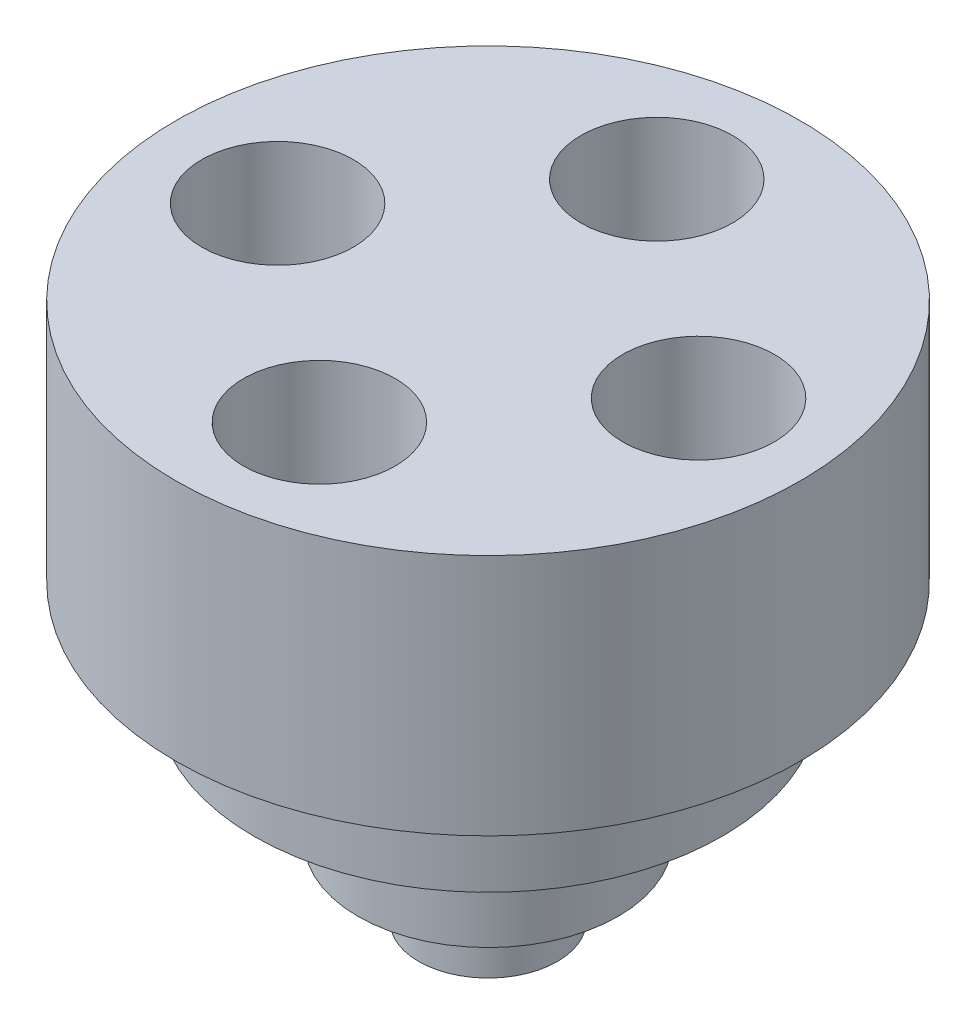
ISO-10303-21;
HEADER;
FILE_DESCRIPTION(('STEP AP214'),'2;1');
FILE_NAME('part.step','',(''),(''),'','','');
FILE_SCHEMA(('AUTOMOTIVE_DESIGN { 1 0 10303 214 1 1 1 1 }'));
ENDSEC;
DATA;
#1=APPLICATION_CONTEXT('core data for automotive mechanical design processes');
#2=APPLICATION_PROTOCOL_DEFINITION('international standard','automotive_design',2000,#1);
#3=PRODUCT_CONTEXT('',#1,'mechanical');
#4=PRODUCT('Part','Part','',(#3));
#5=PRODUCT_RELATED_PRODUCT_CATEGORY('part','',(#4));
#6=PRODUCT_DEFINITION_FORMATION('','',#4);
#7=PRODUCT_DEFINITION_CONTEXT('part definition',#1,'design');
#8=PRODUCT_DEFINITION('design','',#6,#7);
#9=PRODUCT_DEFINITION_SHAPE('','',#8);
#10=(LENGTH_UNIT() NAMED_UNIT(*) SI_UNIT(.MILLI.,.METRE.));
#11=(NAMED_UNIT(*) PLANE_ANGLE_UNIT() SI_UNIT($,.RADIAN.));
#12=(NAMED_UNIT(*) SI_UNIT($,.STERADIAN.) SOLID_ANGLE_UNIT());
#13=UNCERTAINTY_MEASURE_WITH_UNIT(LENGTH_MEASURE(1.E-05),#10,'distance_accuracy_value','');
#14=(GEOMETRIC_REPRESENTATION_CONTEXT(3) GLOBAL_UNCERTAINTY_ASSIGNED_CONTEXT((#13)) GLOBAL_UNIT_ASSIGNED_CONTEXT((#10,
#11,#12)) REPRESENTATION_CONTEXT('',''));
#15=CARTESIAN_POINT('',(0.,0.,0.));
#16=DIRECTION('',(0.,0.,1.));
#17=DIRECTION('',(1.,0.,0.));
#18=AXIS2_PLACEMENT_3D('',#15,#16,#17);
#19=CARTESIAN_POINT('',(0.,0.,0.));
#20=DIRECTION('',(0.,1.,0.));
#21=DIRECTION('',(0.,0.,1.));
#22=AXIS2_PLACEMENT_3D('',#19,#20,#21);
#23=PLANE('',#22);
#24=CARTESIAN_POINT('',(0.,0.,0.));
#25=DIRECTION('',(0.,1.,0.));
#26=DIRECTION('',(0.,0.,1.));
#27=AXIS2_PLACEMENT_3D('',#24,#25,#26);
#28=CIRCLE('',#27,9.525);
#29=CARTESIAN_POINT('',(0.,0.,9.525));
#30=VERTEX_POINT('',#29);
#31=EDGE_CURVE('E44',#30,#30,#28,.T.);
#32=ORIENTED_EDGE('',*,*,#31,.F.);
#33=EDGE_LOOP('',(#32));
#34=FACE_BOUND('',#33,.T.);
#35=CARTESIAN_POINT('',(0.,0.,0.));
#36=DIRECTION('',(0.,1.,0.));
#37=DIRECTION('',(0.,0.,1.));
#38=AXIS2_PLACEMENT_3D('',#35,#36,#37);
#39=CIRCLE('',#38,5.08);
#40=CARTESIAN_POINT('',(0.,0.,5.08));
#41=VERTEX_POINT('',#40);
#42=EDGE_CURVE('E11',#41,#41,#39,.F.);
#43=ORIENTED_EDGE('',*,*,#42,.F.);
#44=EDGE_LOOP('',(#43));
#45=FACE_BOUND('',#44,.T.);
#46=ADVANCED_FACE('F35',(#34,#45),#23,.F.);
#47=CARTESIAN_POINT('',(0.,16.51,0.));
#48=DIRECTION('',(0.,1.,0.));
#49=DIRECTION('',(0.,0.,1.));
#50=AXIS2_PLACEMENT_3D('',#47,#48,#49);
#51=PLANE('',#50);
#52=CARTESIAN_POINT('',(0.,16.51,0.));
#53=DIRECTION('',(0.,1.,0.));
#54=DIRECTION('',(0.,0.,1.));
#55=AXIS2_PLACEMENT_3D('',#52,#53,#54);
#56=CIRCLE('',#55,17.145);
#57=CARTESIAN_POINT('',(0.,16.51,17.145));
#58=VERTEX_POINT('',#57);
#59=EDGE_CURVE('E81',#58,#58,#56,.T.);
#60=ORIENTED_EDGE('',*,*,#59,.T.);
#61=EDGE_LOOP('',(#60));
#62=FACE_BOUND('',#61,.T.);
#63=CARTESIAN_POINT('',(0.,16.51,0.));
#64=DIRECTION('',(0.,1.,0.));
#65=DIRECTION('',(0.,0.,1.));
#66=AXIS2_PLACEMENT_3D('',#63,#64,#65);
#67=CIRCLE('',#66,22.86);
#68=CARTESIAN_POINT('',(0.,16.51,22.86));
#69=VERTEX_POINT('',#68);
#70=EDGE_CURVE('E69',#69,#69,#67,.T.);
#71=ORIENTED_EDGE('',*,*,#70,.F.);
#72=EDGE_LOOP('',(#71));
#73=FACE_BOUND('',#72,.T.);
#74=ADVANCED_FACE('F173',(#62,#73),#51,.F.);
#75=CARTESIAN_POINT('',(0.,34.29,0.));
#76=DIRECTION('',(0.,-1.,0.));
#77=DIRECTION('',(0.,0.,-1.));
#78=AXIS2_PLACEMENT_3D('',#75,#76,#77);
#79=CYLINDRICAL_SURFACE('',#78,22.86);
#80=CARTESIAN_POINT('',(0.,34.29,0.));
#81=DIRECTION('',(0.,1.,0.));
#82=DIRECTION('',(0.,0.,1.));
#83=AXIS2_PLACEMENT_3D('',#80,#81,#82);
#84=CIRCLE('',#83,22.86);
#85=CARTESIAN_POINT('',(0.,34.29,22.86));
#86=VERTEX_POINT('',#85);
#87=EDGE_CURVE('E151',#86,#86,#84,.T.);
#88=ORIENTED_EDGE('',*,*,#87,.F.);
#89=EDGE_LOOP('',(#88));
#90=FACE_BOUND('',#89,.T.);
#91=ORIENTED_EDGE('',*,*,#70,.T.);
#92=EDGE_LOOP('',(#91));
#93=FACE_BOUND('',#92,.T.);
#94=ADVANCED_FACE('F203',(#90,#93),#79,.T.);
#95=CARTESIAN_POINT('',(0.,34.29,0.));
#96=DIRECTION('',(0.,1.,0.));
#97=DIRECTION('',(0.,0.,1.));
#98=AXIS2_PLACEMENT_3D('',#95,#96,#97);
#99=PLANE('',#98);
#100=CARTESIAN_POINT('',(1.53058839909443,34.29,13.8858992921797));
#101=DIRECTION('',(0.,1.,0.));
#102=DIRECTION('',(0.,0.,1.));
#103=AXIS2_PLACEMENT_3D('',#100,#101,#102);
#104=CIRCLE('',#103,5.55625);
#105=CARTESIAN_POINT('',(1.53058839909443,34.29,19.4421492921797));
#106=VERTEX_POINT('',#105);
#107=EDGE_CURVE('E123',#106,#106,#104,.T.);
#108=ORIENTED_EDGE('',*,*,#107,.F.);
#109=EDGE_LOOP('',(#108));
#110=FACE_BOUND('',#109,.T.);
#111=CARTESIAN_POINT('',(13.8858992921797,34.29,-1.53058839909443));
#112=DIRECTION('',(0.,1.,0.));
#113=DIRECTION('',(0.,0.,1.));
#114=AXIS2_PLACEMENT_3D('',#111,#112,#113);
#115=CIRCLE('',#114,5.55625);
#116=CARTESIAN_POINT('',(13.8858992921797,34.29,4.02566160090557));
#117=VERTEX_POINT('',#116);
#118=EDGE_CURVE('E127',#117,#117,#115,.T.);
#119=ORIENTED_EDGE('',*,*,#118,.F.);
#120=EDGE_LOOP('',(#119));
#121=FACE_BOUND('',#120,.T.);
#122=CARTESIAN_POINT('',(-1.53058839909443,34.29,-13.8858992921797));
#123=DIRECTION('',(0.,1.,0.));
#124=DIRECTION('',(0.,0.,1.));
#125=AXIS2_PLACEMENT_3D('',#122,#123,#124);
#126=CIRCLE('',#125,5.55625);
#127=CARTESIAN_POINT('',(-1.53058839909443,34.29,-8.32964929217973));
#128=VERTEX_POINT('',#127);
#129=EDGE_CURVE('E133',#128,#128,#126,.T.);
#130=ORIENTED_EDGE('',*,*,#129,.F.);
#131=EDGE_LOOP('',(#130));
#132=FACE_BOUND('',#131,.T.);
#133=CARTESIAN_POINT('',(-13.8858992921797,34.29,1.53058839909443));
#134=DIRECTION('',(0.,1.,0.));
#135=DIRECTION('',(0.,0.,1.));
#136=AXIS2_PLACEMENT_3D('',#133,#134,#135);
#137=CIRCLE('',#136,5.55625);
#138=CARTESIAN_POINT('',(-13.8858992921797,34.29,7.08683839909443));
#139=VERTEX_POINT('',#138);
#140=EDGE_CURVE('E139',#139,#139,#137,.T.);
#141=ORIENTED_EDGE('',*,*,#140,.F.);
#142=EDGE_LOOP('',(#141));
#143=FACE_BOUND('',#142,.T.);
#144=ORIENTED_EDGE('',*,*,#87,.T.);
#145=EDGE_LOOP('',(#144));
#146=FACE_BOUND('',#145,.T.);
#147=ADVANCED_FACE('F208',(#110,#121,#132,#143,#146),#99,.T.);
#148=CARTESIAN_POINT('',(-13.8858992921797,23.1775,1.53058839909443));
#149=DIRECTION('',(0.,1.,0.));
#150=DIRECTION('',(0.,0.,1.));
#151=AXIS2_PLACEMENT_3D('',#148,#149,#150);
#152=CYLINDRICAL_SURFACE('',#151,5.55625);
#153=CARTESIAN_POINT('',(-13.8858992921797,23.1775,1.53058839909443));
#154=DIRECTION('',(0.,1.,0.));
#155=DIRECTION('',(0.,0.,1.));
#156=AXIS2_PLACEMENT_3D('',#153,#154,#155);
#157=CIRCLE('',#156,5.55625);
#158=CARTESIAN_POINT('',(-13.8858992921797,23.1775,7.08683839909443));
#159=VERTEX_POINT('',#158);
#160=EDGE_CURVE('E142',#159,#159,#157,.T.);
#161=ORIENTED_EDGE('',*,*,#160,.F.);
#162=EDGE_LOOP('',(#161));
#163=FACE_BOUND('',#162,.T.);
#164=ORIENTED_EDGE('',*,*,#140,.T.);
#165=EDGE_LOOP('',(#164));
#166=FACE_BOUND('',#165,.T.);
#167=ADVANCED_FACE('F214',(#163,#166),#152,.F.);
#168=CARTESIAN_POINT('',(-13.8858992921797,23.1775,1.53058839909443));
#169=DIRECTION('',(0.,1.,0.));
#170=DIRECTION('',(0.,0.,1.));
#171=AXIS2_PLACEMENT_3D('',#168,#169,#170);
#172=PLANE('',#171);
#173=ORIENTED_EDGE('',*,*,#160,.T.);
#174=EDGE_LOOP('',(#173));
#175=FACE_BOUND('',#174,.T.);
#176=ADVANCED_FACE('F221',(#175),#172,.T.);
#177=CARTESIAN_POINT('',(-1.53058839909443,23.1775,-13.8858992921797));
#178=DIRECTION('',(0.,1.,0.));
#179=DIRECTION('',(0.,0.,1.));
#180=AXIS2_PLACEMENT_3D('',#177,#178,#179);
#181=CYLINDRICAL_SURFACE('',#180,5.55625);
#182=CARTESIAN_POINT('',(-1.53058839909443,23.1775,-13.8858992921797));
#183=DIRECTION('',(0.,1.,0.));
#184=DIRECTION('',(0.,0.,1.));
#185=AXIS2_PLACEMENT_3D('',#182,#183,#184);
#186=CIRCLE('',#185,5.55625);
#187=CARTESIAN_POINT('',(-1.53058839909443,23.1775,-8.32964929217973));
#188=VERTEX_POINT('',#187);
#189=EDGE_CURVE('E136',#188,#188,#186,.T.);
#190=ORIENTED_EDGE('',*,*,#189,.F.);
#191=EDGE_LOOP('',(#190));
#192=FACE_BOUND('',#191,.T.);
#193=ORIENTED_EDGE('',*,*,#129,.T.);
#194=EDGE_LOOP('',(#193));
#195=FACE_BOUND('',#194,.T.);
#196=ADVANCED_FACE('F233',(#192,#195),#181,.F.);
#197=CARTESIAN_POINT('',(-1.53058839909443,23.1775,-13.8858992921797));
#198=DIRECTION('',(0.,1.,0.));
#199=DIRECTION('',(0.,0.,1.));
#200=AXIS2_PLACEMENT_3D('',#197,#198,#199);
#201=PLANE('',#200);
#202=ORIENTED_EDGE('',*,*,#189,.T.);
#203=EDGE_LOOP('',(#202));
#204=FACE_BOUND('',#203,.T.);
#205=ADVANCED_FACE('F235',(#204),#201,.T.);
#206=CARTESIAN_POINT('',(13.8858992921797,23.1775,-1.53058839909443));
#207=DIRECTION('',(0.,1.,0.));
#208=DIRECTION('',(0.,0.,1.));
#209=AXIS2_PLACEMENT_3D('',#206,#207,#208);
#210=CYLINDRICAL_SURFACE('',#209,5.55625);
#211=CARTESIAN_POINT('',(13.8858992921797,23.1775,-1.53058839909443));
#212=DIRECTION('',(0.,1.,0.));
#213=DIRECTION('',(0.,0.,1.));
#214=AXIS2_PLACEMENT_3D('',#211,#212,#213);
#215=CIRCLE('',#214,5.55625);
#216=CARTESIAN_POINT('',(13.8858992921797,23.1775,4.02566160090557));
#217=VERTEX_POINT('',#216);
#218=EDGE_CURVE('E130',#217,#217,#215,.T.);
#219=ORIENTED_EDGE('',*,*,#218,.F.);
#220=EDGE_LOOP('',(#219));
#221=FACE_BOUND('',#220,.T.);
#222=ORIENTED_EDGE('',*,*,#118,.T.);
#223=EDGE_LOOP('',(#222));
#224=FACE_BOUND('',#223,.T.);
#225=ADVANCED_FACE('F242',(#221,#224),#210,.F.);
#226=CARTESIAN_POINT('',(13.8858992921797,23.1775,-1.53058839909443));
#227=DIRECTION('',(0.,1.,0.));
#228=DIRECTION('',(0.,0.,1.));
#229=AXIS2_PLACEMENT_3D('',#226,#227,#228);
#230=PLANE('',#229);
#231=ORIENTED_EDGE('',*,*,#218,.T.);
#232=EDGE_LOOP('',(#231));
#233=FACE_BOUND('',#232,.T.);
#234=ADVANCED_FACE('F304',(#233),#230,.T.);
#235=CARTESIAN_POINT('',(1.53058839909443,23.1775,13.8858992921797));
#236=DIRECTION('',(0.,1.,0.));
#237=DIRECTION('',(0.,0.,1.));
#238=AXIS2_PLACEMENT_3D('',#235,#236,#237);
#239=CYLINDRICAL_SURFACE('',#238,5.55625);
#240=CARTESIAN_POINT('',(1.53058839909443,23.1775,13.8858992921797));
#241=DIRECTION('',(0.,1.,0.));
#242=DIRECTION('',(0.,0.,1.));
#243=AXIS2_PLACEMENT_3D('',#240,#241,#242);
#244=CIRCLE('',#243,5.55625);
#245=CARTESIAN_POINT('',(1.53058839909443,23.1775,19.4421492921797));
#246=VERTEX_POINT('',#245);
#247=EDGE_CURVE('E124',#246,#246,#244,.T.);
#248=ORIENTED_EDGE('',*,*,#247,.F.);
#249=EDGE_LOOP('',(#248));
#250=FACE_BOUND('',#249,.T.);
#251=ORIENTED_EDGE('',*,*,#107,.T.);
#252=EDGE_LOOP('',(#251));
#253=FACE_BOUND('',#252,.T.);
#254=ADVANCED_FACE('F313',(#250,#253),#239,.F.);
#255=CARTESIAN_POINT('',(1.53058839909443,23.1775,13.8858992921797));
#256=DIRECTION('',(0.,1.,0.));
#257=DIRECTION('',(0.,0.,1.));
#258=AXIS2_PLACEMENT_3D('',#255,#256,#257);
#259=PLANE('',#258);
#260=ORIENTED_EDGE('',*,*,#247,.T.);
#261=EDGE_LOOP('',(#260));
#262=FACE_BOUND('',#261,.T.);
#263=ADVANCED_FACE('F114',(#262),#259,.T.);
#264=CARTESIAN_POINT('',(9.52359041588835,8.89,-0.163861497611936));
#265=DIRECTION('',(0.,-1.,0.));
#266=DIRECTION('',(0.,0.,-1.));
#267=AXIS2_PLACEMENT_3D('',#264,#265,#266);
#268=PLANE('',#267);
#269=CARTESIAN_POINT('',(0.,8.89,0.));
#270=DIRECTION('',(0.,1.,0.));
#271=DIRECTION('',(0.,0.,1.));
#272=AXIS2_PLACEMENT_3D('',#269,#270,#271);
#273=CIRCLE('',#272,9.525);
#274=CARTESIAN_POINT('',(0.,8.89,9.525));
#275=VERTEX_POINT('',#274);
#276=EDGE_CURVE('E87',#275,#275,#273,.T.);
#277=ORIENTED_EDGE('',*,*,#276,.T.);
#278=EDGE_LOOP('',(#277));
#279=FACE_BOUND('',#278,.T.);
#280=CARTESIAN_POINT('',(0.,8.89,0.));
#281=DIRECTION('',(0.,1.,0.));
#282=DIRECTION('',(0.,0.,1.));
#283=AXIS2_PLACEMENT_3D('',#280,#281,#282);
#284=CIRCLE('',#283,17.145);
#285=CARTESIAN_POINT('',(0.,8.89,17.145));
#286=VERTEX_POINT('',#285);
#287=EDGE_CURVE('E84',#286,#286,#284,.T.);
#288=ORIENTED_EDGE('',*,*,#287,.F.);
#289=EDGE_LOOP('',(#288));
#290=FACE_BOUND('',#289,.T.);
#291=ADVANCED_FACE('F112',(#279,#290),#268,.T.);
#292=CARTESIAN_POINT('',(0.,16.51,0.));
#293=DIRECTION('',(0.,1.,0.));
#294=DIRECTION('',(0.,0.,1.));
#295=AXIS2_PLACEMENT_3D('',#292,#293,#294);
#296=CYLINDRICAL_SURFACE('',#295,17.145);
#297=ORIENTED_EDGE('',*,*,#287,.T.);
#298=EDGE_LOOP('',(#297));
#299=FACE_BOUND('',#298,.T.);
#300=ORIENTED_EDGE('',*,*,#59,.F.);
#301=EDGE_LOOP('',(#300));
#302=FACE_BOUND('',#301,.T.);
#303=ADVANCED_FACE('F186',(#299,#302),#296,.T.);
#304=CARTESIAN_POINT('',(0.,10.16,0.));
#305=DIRECTION('',(0.,-1.,0.));
#306=DIRECTION('',(0.,0.,-1.));
#307=AXIS2_PLACEMENT_3D('',#304,#305,#306);
#308=PLANE('',#307);
#309=CARTESIAN_POINT('',(0.,10.16,0.));
#310=DIRECTION('',(0.,-1.,0.));
#311=DIRECTION('',(0.,0.,-1.));
#312=AXIS2_PLACEMENT_3D('',#309,#310,#311);
#313=CIRCLE('',#312,3.175);
#314=CARTESIAN_POINT('',(0.874388209955176,10.16,3.0522238217882));
#315=VERTEX_POINT('',#314);
#316=CARTESIAN_POINT('',(3.0804974726822,10.16,0.768869508303318));
#317=VERTEX_POINT('',#316);
#318=EDGE_CURVE('E67',#315,#317,#313,.T.);
#319=ORIENTED_EDGE('',*,*,#318,.T.);
#320=DIRECTION('',(-0.694837563063629,0.,0.719166712908625));
#321=VECTOR('',#320,1.);
#322=CARTESIAN_POINT('',(3.0804974726822,10.16,0.768869508303318));
#323=LINE('',#322,#321);
#324=EDGE_CURVE('E148',#317,#315,#323,.T.);
#325=ORIENTED_EDGE('',*,*,#324,.T.);
#326=EDGE_LOOP('',(#319,#325));
#327=FACE_BOUND('',#326,.T.);
#328=ADVANCED_FACE('F188',(#327),#308,.T.);
#329=CARTESIAN_POINT('',(0.,10.16,0.));
#330=DIRECTION('',(0.,-1.,0.));
#331=DIRECTION('',(0.,0.,-1.));
#332=AXIS2_PLACEMENT_3D('',#329,#330,#331);
#333=CYLINDRICAL_SURFACE('',#332,3.175);
#334=CARTESIAN_POINT('',(-3.06976817753862,5.08,-0.81064686280229));
#335=CARTESIAN_POINT('',(-3.06976913840145,5.16105981289465,-0.810655246319833));
#336=CARTESIAN_POINT('',(-3.06791721635891,5.2422285865464,-0.817758791508856));
#337=CARTESIAN_POINT('',(-3.06035925542122,5.40209836960302,-0.84558946699014));
#338=CARTESIAN_POINT('',(-3.05464473753374,5.48079355053317,-0.8663465662375));
#339=CARTESIAN_POINT('',(-3.03898978155968,5.63310475971244,-0.91974370224845));
#340=CARTESIAN_POINT('',(-3.02907095534206,5.70674455594437,-0.952322847273928));
#341=CARTESIAN_POINT('',(-3.00444385189214,5.84787390724584,-1.02737386921027));
#342=CARTESIAN_POINT('',(-2.98973551211098,5.91536338198026,-1.06984587531533));
#343=CARTESIAN_POINT('',(-2.95349905150476,6.04812730009353,-1.16632882760117));
#344=CARTESIAN_POINT('',(-2.93152654040043,6.11281290201341,-1.22098350521038));
#345=CARTESIAN_POINT('',(-2.88041524499832,6.2325678949415,-1.3371081045835));
#346=CARTESIAN_POINT('',(-2.85127304139393,6.2876326761811,-1.3985812704564));
#347=CARTESIAN_POINT('',(-2.78304102448946,6.3900017628374,-1.53007451531746));
#348=CARTESIAN_POINT('',(-2.74343689453417,6.43659088378092,-1.60038946609399));
#349=CARTESIAN_POINT('',(-2.65502595833228,6.51570430860924,-1.74312647508726));
#350=CARTESIAN_POINT('',(-2.60622471989421,6.54823708299022,-1.8155472361572));
#351=CARTESIAN_POINT('',(-2.5035512653862,6.5960124893895,-1.95442977285777));
#352=CARTESIAN_POINT('',(-2.45025380066452,6.61228509810286,-2.02096046032934));
#353=CARTESIAN_POINT('',(-2.33735561658314,6.63046065731155,-2.15052561606007));
#354=CARTESIAN_POINT('',(-2.27775852870956,6.63237184128888,-2.21356206700294));
#355=CARTESIAN_POINT('',(-2.15941226619995,6.62218958878325,-2.3289112561672));
#356=CARTESIAN_POINT('',(-2.10100323165108,6.61124529784359,-2.38167980306992));
#357=CARTESIAN_POINT('',(-1.98246406457228,6.5777060401645,-2.48122003564775));
#358=CARTESIAN_POINT('',(-1.92233380401248,6.55511020461073,-2.52799127380004));
#359=CARTESIAN_POINT('',(-1.80147893668518,6.49873695226312,-2.61552114133565));
#360=CARTESIAN_POINT('',(-1.74075812888509,6.46480423999866,-2.65618421257121));
#361=CARTESIAN_POINT('',(-1.62155413116324,6.38692178583668,-2.73059184287274));
#362=CARTESIAN_POINT('',(-1.56307176189432,6.3429684104926,-2.76433388395349));
#363=CARTESIAN_POINT('',(-1.44506757400585,6.24167819197471,-2.82794935481691));
#364=CARTESIAN_POINT('',(-1.38593745308126,6.18348631603731,-2.85718924501811));
#365=CARTESIAN_POINT('',(-1.27493749500988,6.05767370628716,-2.90841952842798));
#366=CARTESIAN_POINT('',(-1.22307280020712,5.99004636111026,-2.93040480171354));
#367=CARTESIAN_POINT('',(-1.12637982553695,5.84242937691087,-2.96896647473589));
#368=CARTESIAN_POINT('',(-1.08213918880342,5.76194848540122,-2.98515211842797));
#369=CARTESIAN_POINT('',(-1.00779050362935,5.59375175425882,-3.01107118047224));
#370=CARTESIAN_POINT('',(-0.977668301202257,5.50604326462412,-3.02081106486912));
#371=CARTESIAN_POINT('',(-0.936006087715758,5.33309178079371,-3.03396823717314));
#372=CARTESIAN_POINT('',(-0.923201259636601,5.24818902249952,-3.03781896986536));
#373=CARTESIAN_POINT('',(-0.913196461799749,5.07740679789987,-3.04084399159102));
#374=CARTESIAN_POINT('',(-0.915986595837991,4.99152798550199,-3.04002124630064));
#375=CARTESIAN_POINT('',(-0.935783195551142,4.83054318718606,-3.03397688324716));
#376=CARTESIAN_POINT('',(-0.951312379995213,4.75523103008519,-3.02921195030097));
#377=CARTESIAN_POINT('',(-0.993519458551047,4.60819095745989,-3.01563123395814));
#378=CARTESIAN_POINT('',(-1.0202007615719,4.53646414539314,-3.00681421186242));
#379=CARTESIAN_POINT('',(-1.08453120201911,4.39485496861429,-2.98422953425085));
#380=CARTESIAN_POINT('',(-1.12263207474599,4.32521288316388,-2.97025101988419));
#381=CARTESIAN_POINT('',(-1.20723699111156,4.19265074352268,-2.93688112141925));
#382=CARTESIAN_POINT('',(-1.25374531158437,4.12973413659704,-2.91748697966581));
#383=CARTESIAN_POINT('',(-1.35916756901,4.00457963412754,-2.87001914108669));
#384=CARTESIAN_POINT('',(-1.41889919398369,3.94331374839576,-2.84118714468534));
#385=CARTESIAN_POINT('',(-1.54389184707842,3.83181009229823,-2.77525027139561));
#386=CARTESIAN_POINT('',(-1.60915446537139,3.78157550846331,-2.73814301031513));
#387=CARTESIAN_POINT('',(-1.74405417781073,3.69266846697449,-2.65430488860015));
#388=CARTESIAN_POINT('',(-1.81375572344668,3.65427286938596,-2.60738132597082));
#389=CARTESIAN_POINT('',(-1.9531612558085,3.59222278101004,-2.50464728439156));
#390=CARTESIAN_POINT('',(-2.02286519142487,3.56855594982578,-2.44884429437237));
#391=CARTESIAN_POINT('',(-2.15313139551309,3.53858508169764,-2.33483796319874));
#392=CARTESIAN_POINT('',(-2.21395537295518,3.5309241304106,-2.27728941626333));
#393=CARTESIAN_POINT('',(-2.33090447306995,3.52923453714964,-2.15743143013339));
#394=CARTESIAN_POINT('',(-2.38703108268263,3.53520156422447,-2.09512350954336));
#395=CARTESIAN_POINT('',(-2.48971362511239,3.55967807842335,-1.97180220603153));
#396=CARTESIAN_POINT('',(-2.53664426525126,3.57740152133505,-1.91094111092513));
#397=CARTESIAN_POINT('',(-2.62415437502735,3.62385993831769,-1.78887745165132));
#398=CARTESIAN_POINT('',(-2.66473289060278,3.65259656429059,-1.72767483761616));
#399=CARTESIAN_POINT('',(-2.74093257468101,3.7216014196314,-1.60418513962218));
#400=CARTESIAN_POINT('',(-2.77625743056351,3.76232101402463,-1.54196864037778));
#401=CARTESIAN_POINT('',(-2.83994501738139,3.8535601103172,-1.4212677780981));
#402=CARTESIAN_POINT('',(-2.86830453008227,3.90408412297766,-1.36278514944334));
#403=CARTESIAN_POINT('',(-2.92097611148893,4.01909488109523,-1.24619229966502));
#404=CARTESIAN_POINT('',(-2.94464475070827,4.08445347754374,-1.18864888948119));
#405=CARTESIAN_POINT('',(-2.98514121468292,4.22435687828615,-1.08294491616828));
#406=CARTESIAN_POINT('',(-3.00196346543861,4.29890910350798,-1.03479201488328));
#407=CARTESIAN_POINT('',(-3.02999575712892,4.45760028467982,-0.949639753609053));
#408=CARTESIAN_POINT('',(-3.04105717351782,4.54193031081683,-0.912944717393128));
#409=CARTESIAN_POINT('',(-3.05774010775043,4.71620358416174,-0.855436334744428));
#410=CARTESIAN_POINT('',(-3.06337987857345,4.80612690391491,-0.834569749296009));
#411=CARTESIAN_POINT('',(-3.06764805183697,4.92745459928647,-0.818638584209134));
#412=CARTESIAN_POINT('',(-3.06844388249826,4.95787533323064,-0.815647708636561));
#413=CARTESIAN_POINT('',(-3.06950378064001,5.01885887047183,-0.811650205008027));
#414=CARTESIAN_POINT('',(-3.06976781507086,5.04942168248029,-0.810643700275111));
#415=CARTESIAN_POINT('',(-3.06976817753862,5.08,-0.81064686280229));
#416=B_SPLINE_CURVE_WITH_KNOTS('',3,(#334,#335,#336,#337,#338,#339,#340,#341,#342,#343,#344,
#345,#346,#347,#348,#349,#350,#351,#352,#353,#354,#355,#356,#357,#358,#359,#360,#361,#362,#363,
#364,#365,#366,#367,#368,#369,#370,#371,#372,#373,#374,#375,#376,#377,#378,#379,#380,#381,#382,
#383,#384,#385,#386,#387,#388,#389,#390,#391,#392,#393,#394,#395,#396,#397,#398,#399,#400,#401,
#402,#403,#404,#405,#406,#407,#408,#409,#410,#411,#412,#413,#414,#415),.UNSPECIFIED.,.T.,.F.,(4,
2,2,2,2,2,2,2,2,2,2,2,2,2,2,2,2,2,2,2,2,2,2,2,2,2,2,2,2,2,2,2,2,2,2,2,2,2,2,2,4),(0.,
0.243050870799524,0.486637015870486,0.728985929641907,0.971338008506616,1.2326972102399,
1.49418129954804,1.77227599582368,2.050202874905,2.309129565927,2.56790780155156,
2.80520880125547,3.0425274982123,3.28324029137252,3.52404050509842,3.78680349598929,
4.04975153637547,4.32805230520024,4.60607347252385,4.86243562617205,5.11863511677474,
5.34873367784891,5.5789026254934,5.81975877369402,6.0607377909831,6.33039763840803,
6.60013527831734,6.87577147896024,7.15117642767202,7.40208937877601,7.65292260121337,
7.88847860924194,8.12406996289344,8.37001709466104,8.61607764981534,8.88559153521475,
9.15532440898535,9.43170879402706,9.70715938660681,9.79884014178521,9.89052659448414),.UNSPECIFIED.);
#417=CARTESIAN_POINT('',(-3.06976817753862,5.08,-0.81064686280229));
#418=VERTEX_POINT('',#417);
#419=EDGE_CURVE('E91',#418,#418,#416,.T.);
#420=ORIENTED_EDGE('',*,*,#419,.T.);
#421=EDGE_LOOP('',(#420));
#422=FACE_BOUND('',#421,.T.);
#423=DIRECTION('',(0.,-1.,0.));
#424=VECTOR('',#423,1.);
#425=CARTESIAN_POINT('',(0.874388209955176,10.16,3.0522238217882));
#426=LINE('',#425,#424);
#427=CARTESIAN_POINT('',(0.874388209955176,-5.08,3.0522238217882));
#428=VERTEX_POINT('',#427);
#429=EDGE_CURVE('E51',#315,#428,#426,.T.);
#430=ORIENTED_EDGE('',*,*,#429,.T.);
#431=CARTESIAN_POINT('',(0.,-5.08,0.));
#432=DIRECTION('',(0.,-1.,0.));
#433=DIRECTION('',(0.,0.,-1.));
#434=AXIS2_PLACEMENT_3D('',#431,#432,#433);
#435=CIRCLE('',#434,3.175);
#436=CARTESIAN_POINT('',(3.0804974726822,-5.08,0.768869508303318));
#437=VERTEX_POINT('',#436);
#438=EDGE_CURVE('E65',#428,#437,#435,.T.);
#439=ORIENTED_EDGE('',*,*,#438,.T.);
#440=DIRECTION('',(0.,-1.,0.));
#441=VECTOR('',#440,1.);
#442=CARTESIAN_POINT('',(3.0804974726822,10.16,0.768869508303318));
#443=LINE('',#442,#441);
#444=EDGE_CURVE('E58',#317,#437,#443,.T.);
#445=ORIENTED_EDGE('',*,*,#444,.F.);
#446=ORIENTED_EDGE('',*,*,#318,.F.);
#447=EDGE_LOOP('',(#430,#439,#445,#446));
#448=FACE_BOUND('',#447,.T.);
#449=ADVANCED_FACE('F63',(#422,#448),#333,.F.);
#450=CARTESIAN_POINT('',(3.0804974726822,10.16,0.768869508303318));
#451=DIRECTION('',(0.719166712908625,0.,0.694837563063629));
#452=DIRECTION('',(0.694837563063629,0.,-0.719166712908625));
#453=AXIS2_PLACEMENT_3D('',#450,#451,#452);
#454=PLANE('',#453);
#455=CARTESIAN_POINT('',(1.97744284131869,5.08,1.91054666504576));
#456=DIRECTION('',(0.719166712908625,0.,0.694837563063629));
#457=DIRECTION('',(0.694837563063629,0.,-0.719166712908625));
#458=AXIS2_PLACEMENT_3D('',#455,#456,#457);
#459=CIRCLE('',#458,1.55);
#460=CARTESIAN_POINT('',(3.05444106406731,5.08,0.795838260037391));
#461=VERTEX_POINT('',#460);
#462=EDGE_CURVE('E90',#461,#461,#459,.T.);
#463=ORIENTED_EDGE('',*,*,#462,.T.);
#464=EDGE_LOOP('',(#463));
#465=FACE_BOUND('',#464,.T.);
#466=ORIENTED_EDGE('',*,*,#444,.T.);
#467=DIRECTION('',(-0.694837563063629,0.,0.719166712908625));
#468=VECTOR('',#467,1.);
#469=CARTESIAN_POINT('',(0.874388209955176,-5.08,3.0522238217882));
#470=LINE('',#469,#468);
#471=EDGE_CURVE('E71',#437,#428,#470,.T.);
#472=ORIENTED_EDGE('',*,*,#471,.T.);
#473=ORIENTED_EDGE('',*,*,#429,.F.);
#474=ORIENTED_EDGE('',*,*,#324,.F.);
#475=EDGE_LOOP('',(#466,#472,#473,#474));
#476=FACE_BOUND('',#475,.T.);
#477=ADVANCED_FACE('F72',(#465,#476),#454,.F.);
#478=CARTESIAN_POINT('',(15.8573604004552,5.08,15.3209116321738));
#479=DIRECTION('',(-0.719166712908626,0.,-0.694837563063629));
#480=DIRECTION('',(-0.694837563063629,0.,0.719166712908625));
#481=AXIS2_PLACEMENT_3D('',#478,#479,#480);
#482=CYLINDRICAL_SURFACE('',#481,1.55);
#483=ORIENTED_EDGE('',*,*,#419,.F.);
#484=EDGE_LOOP('',(#483));
#485=FACE_BOUND('',#484,.T.);
#486=CARTESIAN_POINT('',(-7.8357545772856,5.08,-5.41540166603989));
#487=CARTESIAN_POINT('',(-7.83575324997068,4.99355651923422,-5.41540524916417));
#488=CARTESIAN_POINT('',(-7.83157991708569,4.90706510154214,-5.42145756095036));
#489=CARTESIAN_POINT('',(-7.81493113452574,4.73650695284227,-5.44542754802881));
#490=CARTESIAN_POINT('',(-7.80244792024335,4.65244256633088,-5.46335632040076));
#491=CARTESIAN_POINT('',(-7.76935265976865,4.48923162564571,-5.51031793688623));
#492=CARTESIAN_POINT('',(-7.74874727042452,4.41008110545614,-5.53934168708724));
#493=CARTESIAN_POINT('',(-7.69968615286239,4.25881714916317,-5.60733516160597));
#494=CARTESIAN_POINT('',(-7.67123135627496,4.18670287931531,-5.64630370555478));
#495=CARTESIAN_POINT('',(-7.60659508386337,4.05087122646825,-5.73308640690299));
#496=CARTESIAN_POINT('',(-7.57035061235111,3.98722959741905,-5.78097223010221));
#497=CARTESIAN_POINT('',(-7.49084133182464,3.87080739119932,-5.88363223058735));
#498=CARTESIAN_POINT('',(-7.44757611452778,3.8180274460815,-5.93840680843845));
#499=CARTESIAN_POINT('',(-7.3545264836197,3.72454366527892,-6.05326775155297));
#500=CARTESIAN_POINT('',(-7.30470642224056,3.68391015534909,-6.1133825319469));
#501=CARTESIAN_POINT('',(-7.19977843453152,3.61632453017893,-6.23661419041254));
#502=CARTESIAN_POINT('',(-7.14467083639862,3.58937156644051,-6.29973088203336));
#503=CARTESIAN_POINT('',(-7.03099663890521,3.55014333596942,-6.426342835091));
#504=CARTESIAN_POINT('',(-6.97246478016368,3.53774088411398,-6.48982986596191));
#505=CARTESIAN_POINT('',(-6.85307535129313,3.52757038603948,-6.61577733377698));
#506=CARTESIAN_POINT('',(-6.79221793244169,3.52980138952043,-6.67823783712));
#507=CARTESIAN_POINT('',(-6.67054203577694,3.54873499516576,-6.79976626703907));
#508=CARTESIAN_POINT('',(-6.6097286177211,3.56530073254367,-6.85886066170607));
#509=CARTESIAN_POINT('',(-6.4894390010065,3.61221821895772,-6.97278087853154));
#510=CARTESIAN_POINT('',(-6.4299628416244,3.64257037236124,-7.02760657543019));
#511=CARTESIAN_POINT('',(-6.31400749148925,3.71633612457042,-7.13197393824874));
#512=CARTESIAN_POINT('',(-6.25754258716924,3.75980641821306,-7.18149137768214));
#513=CARTESIAN_POINT('',(-6.14978898407489,3.85853298814968,-7.27397898079453));
#514=CARTESIAN_POINT('',(-6.09850068556918,3.91379017480998,-7.31694863831273));
#515=CARTESIAN_POINT('',(-6.0023446202051,4.03528191470373,-7.39604030282452));
#516=CARTESIAN_POINT('',(-5.95755798915114,4.10163605937313,-7.43207734629886));
#517=CARTESIAN_POINT('',(-5.8768071471352,4.24303439375203,-7.49609406973824));
#518=CARTESIAN_POINT('',(-5.84084301036777,4.31807865653505,-7.52407368194302));
#519=CARTESIAN_POINT('',(-5.77913495335513,4.47485985315302,-7.57157509974234));
#520=CARTESIAN_POINT('',(-5.75340160490952,4.55660360515757,-7.59108815846915));
#521=CARTESIAN_POINT('',(-5.71329382049529,4.72438992121692,-7.62132111934059));
#522=CARTESIAN_POINT('',(-5.69891843385021,4.81043212484451,-7.63204175742532));
#523=CARTESIAN_POINT('',(-5.68224898973821,4.98332324416527,-7.6444607236665));
#524=CARTESIAN_POINT('',(-5.67981917793125,5.07015180592387,-7.64626043479339));
#525=CARTESIAN_POINT('',(-5.68677880310712,5.24306781495197,-7.64108565132144));
#526=CARTESIAN_POINT('',(-5.69616780577075,5.32915528933798,-7.6341114791463));
#527=CARTESIAN_POINT('',(-5.72626599588147,5.49761740000759,-7.61156023841545));
#528=CARTESIAN_POINT('',(-5.74690696339944,5.58001120498527,-7.59603500853677));
#529=CARTESIAN_POINT('',(-5.79860782553416,5.73935455025805,-7.5566409355727));
#530=CARTESIAN_POINT('',(-5.82966831712947,5.81630377830438,-7.53277161441576));
#531=CARTESIAN_POINT('',(-5.90129888833341,5.96331929115831,-7.47678895368028));
#532=CARTESIAN_POINT('',(-5.94195033607016,6.0333189652408,-7.44460483742148));
#533=CARTESIAN_POINT('',(-6.03106971510152,6.16376064175308,-7.37259094508103));
#534=CARTESIAN_POINT('',(-6.07953816953247,6.22420200397688,-7.33276065726183));
#535=CARTESIAN_POINT('',(-6.18305615091961,6.33441956335515,-7.24569196293567));
#536=CARTESIAN_POINT('',(-6.23816600956754,6.38408440032611,-7.1983842028737));
#537=CARTESIAN_POINT('',(-6.35263633691623,6.47056011155731,-7.09756614240385));
#538=CARTESIAN_POINT('',(-6.4119966730755,6.50737138641658,-7.04405603536993));
#539=CARTESIAN_POINT('',(-6.53270122072995,6.56692060226395,-6.93225594630538));
#540=CARTESIAN_POINT('',(-6.59403597081727,6.58971745623378,-6.87398715635394));
#541=CARTESIAN_POINT('',(-6.71694423887025,6.62078065787373,-6.75393659815093));
#542=CARTESIAN_POINT('',(-6.77851773776699,6.62904814298798,-6.69215510528527));
#543=CARTESIAN_POINT('',(-6.89932422000775,6.63078640973581,-6.56752589971981));
#544=CARTESIAN_POINT('',(-6.95857601401632,6.62442685952877,-6.50469872132994));
#545=CARTESIAN_POINT('',(-7.07385247333537,6.59745775277511,-6.37914584260551));
#546=CARTESIAN_POINT('',(-7.12987715469458,6.57684826710141,-6.31642014176779));
#547=CARTESIAN_POINT('',(-7.23726497098788,6.522028241783,-6.19308532947704));
#548=CARTESIAN_POINT('',(-7.2886327623383,6.48783147643954,-6.13247414189052));
#549=CARTESIAN_POINT('',(-7.38567138575197,6.40682629444979,-6.01525394910081));
#550=CARTESIAN_POINT('',(-7.43134196813748,6.36001732536295,-5.9586451193463));
#551=CARTESIAN_POINT('',(-7.51660563999808,6.25451200153416,-5.85073094489841));
#552=CARTESIAN_POINT('',(-7.55612673475413,6.19569113823808,-5.79949043331531));
#553=CARTESIAN_POINT('',(-7.62784125874852,6.06809330575151,-5.70483988083221));
#554=CARTESIAN_POINT('',(-7.66003296929781,5.99931400755093,-5.66143167704747));
#555=CARTESIAN_POINT('',(-7.71679450256957,5.85320498607421,-5.58381963631343));
#556=CARTESIAN_POINT('',(-7.74131174969971,5.77582100196684,-5.54967949481447));
#557=CARTESIAN_POINT('',(-7.78206801836093,5.61509929991123,-5.49238465164721));
#558=CARTESIAN_POINT('',(-7.79831538969231,5.53176768442258,-5.46921887120019));
#559=CARTESIAN_POINT('',(-7.81878634629804,5.38674913777515,-5.43989105193312));
#560=CARTESIAN_POINT('',(-7.82514441730159,5.32594481009196,-5.43072700094641));
#561=CARTESIAN_POINT('',(-7.83362897120424,5.20343512660934,-5.41848107967843));
#562=CARTESIAN_POINT('',(-7.8357555251288,5.1417297859508,-5.41539910731028));
#563=CARTESIAN_POINT('',(-7.8357545772856,5.08,-5.41540166603989));
#564=B_SPLINE_CURVE_WITH_KNOTS('',3,(#486,#487,#488,#489,#490,#491,#492,#493,#494,#495,#496,
#497,#498,#499,#500,#501,#502,#503,#504,#505,#506,#507,#508,#509,#510,#511,#512,#513,#514,#515,
#516,#517,#518,#519,#520,#521,#522,#523,#524,#525,#526,#527,#528,#529,#530,#531,#532,#533,#534,
#535,#536,#537,#538,#539,#540,#541,#542,#543,#544,#545,#546,#547,#548,#549,#550,#551,#552,#553,
#554,#555,#556,#557,#558,#559,#560,#561,#562,#563),.UNSPECIFIED.,.T.,.F.,(4,2,2,2,2,2,2,2,2,2,2,
2,2,2,2,2,2,2,2,2,2,2,2,2,2,2,2,2,2,2,2,2,2,2,2,2,2,2,4),(0.,0.259104733974515,0.51845191133198,
0.77758697099523,1.03669128765542,1.29797563216206,1.55927517678028,1.82205953454181,
2.08482759183709,2.34528128055619,2.60571805551944,2.86369533686763,3.12168018539901,
3.38079637848289,3.63993259178113,3.90206648478261,4.16420258217687,4.42660885347387,
4.68899315869099,4.94838861758986,5.207774544472,5.46560504478584,5.72345031982222,
5.98356719596436,6.24370148709751,6.5064078440976,6.76910601276023,7.03069217712522,
7.29225786207988,7.55080480690659,7.80935046584392,8.06763468640997,8.32593022219766,
8.58705300488548,8.8482369561099,9.11117291079051,9.3738428591169,9.55887414311224,
9.74390232135535),.UNSPECIFIED.);
#565=CARTESIAN_POINT('',(-7.8357545772856,5.08,-5.41540166603989));
#566=VERTEX_POINT('',#565);
#567=EDGE_CURVE('E98',#566,#566,#564,.T.);
#568=ORIENTED_EDGE('',*,*,#567,.F.);
#569=EDGE_LOOP('',(#568));
#570=FACE_BOUND('',#569,.T.);
#571=ADVANCED_FACE('F110',(#485,#570),#482,.F.);
#572=ORIENTED_EDGE('',*,*,#462,.F.);
#573=EDGE_LOOP('',(#572));
#574=FACE_BOUND('',#573,.T.);
#575=CARTESIAN_POINT('',(5.68175813178836,5.08,7.64481847605664));
#576=CARTESIAN_POINT('',(5.6817616671301,5.16644348076578,7.64481702626244));
#577=CARTESIAN_POINT('',(5.68766682750467,5.25293489845786,7.64043795486808));
#578=CARTESIAN_POINT('',(5.71104988310918,5.42349304715773,7.62297442281223));
#579=CARTESIAN_POINT('',(5.72853860173606,5.50755743366912,7.60988182038279));
#580=CARTESIAN_POINT('',(5.77433389395862,5.67076837435429,7.57519059816353));
#581=CARTESIAN_POINT('',(5.80263160803025,5.74991889454385,7.55359894412606));
#582=CARTESIAN_POINT('',(5.86889705958846,5.90118285083683,7.50222778720544));
#583=CARTESIAN_POINT('',(5.90686364945429,5.97329712068469,7.47244925600792));
#584=CARTESIAN_POINT('',(5.99137139732625,6.10912877353175,7.40486578529085));
#585=CARTESIAN_POINT('',(6.03798201156513,6.17277040258095,7.36699542195824));
#586=CARTESIAN_POINT('',(6.13784600656653,6.28919260880068,7.28400154331765));
#587=CARTESIAN_POINT('',(6.19109977361158,6.3419725539185,7.23887760618865));
#588=CARTESIAN_POINT('',(6.30269168075216,6.43545633472108,7.14193166080663));
#589=CARTESIAN_POINT('',(6.36105699282161,6.47608984465091,7.09007304836214));
#590=CARTESIAN_POINT('',(6.48060602707209,6.54367546982106,6.98096781172046));
#591=CARTESIAN_POINT('',(6.54178957420307,6.57062843355949,6.92372152194019));
#592=CARTESIAN_POINT('',(6.66441601929618,6.60985666403059,6.80575896518311));
#593=CARTESIAN_POINT('',(6.7258518866943,6.62225911588602,6.74507770140603));
#594=CARTESIAN_POINT('',(6.84761762720121,6.63242961396052,6.62142615546394));
#595=CARTESIAN_POINT('',(6.90794757187374,6.63019861047957,6.55845602220275));
#596=CARTESIAN_POINT('',(7.02521823217453,6.61126500483424,6.43267138347297));
#597=CARTESIAN_POINT('',(7.08218557429045,6.59469926745633,6.36986102422434));
#598=CARTESIAN_POINT('',(7.19190021499637,6.54778178104228,6.24572357900464));
#599=CARTESIAN_POINT('',(7.24464738975187,6.51742962763876,6.18439653659608));
#600=CARTESIAN_POINT('',(7.34496393622382,6.44366387542958,6.06491942518721));
#601=CARTESIAN_POINT('',(7.39250958726864,6.40019358178694,6.0067844675917));
#602=CARTESIAN_POINT('',(7.48123555833421,6.30146701185032,5.89591293036161));
#603=CARTESIAN_POINT('',(7.52241538626362,6.24620982519002,5.84317676817146));
#604=CARTESIAN_POINT('',(7.59815232083389,6.12471808529627,5.744356744677));
#605=CARTESIAN_POINT('',(7.63262730544122,6.05836394062687,5.69835689402659));
#606=CARTESIAN_POINT('',(7.69382818503882,5.91696560624796,5.61545157632816));
#607=CARTESIAN_POINT('',(7.72055401486135,5.84192134346495,5.57854618576184));
#608=CARTESIAN_POINT('',(7.76590446513824,5.68514014684698,5.51524053314768));
#609=CARTESIAN_POINT('',(7.78452070758821,5.60339639484242,5.4888511375475));
#610=CARTESIAN_POINT('',(7.81335600451804,5.43561007878308,5.44772703336708));
#611=CARTESIAN_POINT('',(7.82357576179768,5.34956787515549,5.43299134935566));
#612=CARTESIAN_POINT('',(7.83541392291232,5.17667675583473,5.41590454067393));
#613=CARTESIAN_POINT('',(7.83712897955252,5.08984819407613,5.41341425428911));
#614=CARTESIAN_POINT('',(7.83219668077186,4.91693218504803,5.42054778043741));
#615=CARTESIAN_POINT('',(7.82554963264263,4.83084471066202,5.43017114781655));
#616=CARTESIAN_POINT('',(7.80404716370762,4.66238259999241,5.46102731958397));
#617=CARTESIAN_POINT('',(7.7892412040258,4.57998879501473,5.48219016109365));
#618=CARTESIAN_POINT('',(7.75164903705181,4.42064544974195,5.53521563716291));
#619=CARTESIAN_POINT('',(7.72886237250805,4.34369622169562,5.56707888479409));
#620=CARTESIAN_POINT('',(7.67537704899595,4.19668070884169,5.64059294605335));
#621=CARTESIAN_POINT('',(7.64461045442803,4.1266810347592,5.68232751447268));
#622=CARTESIAN_POINT('',(7.57570502992338,3.99623935824692,5.77387153056762));
#623=CARTESIAN_POINT('',(7.53756570654867,3.93579799602312,5.82368151867448));
#624=CARTESIAN_POINT('',(7.45410972494343,3.82558043664486,5.93013352258439));
#625=CARTESIAN_POINT('',(7.40872582971079,3.7759155996739,5.98683822023625));
#626=CARTESIAN_POINT('',(7.31190539768483,3.68943988844269,6.10470908645231));
#627=CARTESIAN_POINT('',(7.26046904959137,3.65262861358342,6.16587511590111));
#628=CARTESIAN_POINT('',(7.15288755598261,3.59307939773605,6.29035431083831));
#629=CARTESIAN_POINT('',(7.0967632645159,3.57028254376622,6.35365729147934));
#630=CARTESIAN_POINT('',(6.98101199661907,3.53921934212627,6.48062273111121));
#631=CARTESIAN_POINT('',(6.92138529475586,3.53095185701202,6.54428516157073));
#632=CARTESIAN_POINT('',(6.80098578500177,3.52921359026419,6.6693075718908));
#633=CARTESIAN_POINT('',(6.7402341463819,3.53557314047123,6.73068564487022));
#634=CARTESIAN_POINT('',(6.61872126899323,3.56254224722489,6.85021308129322));
#635=CARTESIAN_POINT('',(6.55796003027367,3.58315173289859,6.90836246079333));
#636=CARTESIAN_POINT('',(6.43839252510254,3.637971758217,7.01992961867679));
#637=CARTESIAN_POINT('',(6.37958434393418,3.67216852356046,7.07335212214244));
#638=CARTESIAN_POINT('',(6.26577181098914,3.75317370555021,7.17436586069474));
#639=CARTESIAN_POINT('',(6.210767625968,3.79998267463706,7.22195684021573));
#640=CARTESIAN_POINT('',(6.10585052680858,3.90548799846584,7.31088245570357));
#641=CARTESIAN_POINT('',(6.05599993067746,3.96430886176192,7.35214290920794));
#642=CARTESIAN_POINT('',(5.96387249133787,4.09190669424849,7.42707110789061));
#643=CARTESIAN_POINT('',(5.92159742503174,4.16068599244907,7.46073707219759));
#644=CARTESIAN_POINT('',(5.84598400657978,4.30679501392579,7.52013498021018));
#645=CARTESIAN_POINT('',(5.81270750350209,4.38417899803317,7.54581218822292));
#646=CARTESIAN_POINT('',(5.75684865125343,4.54490070008878,7.58851536274437));
#647=CARTESIAN_POINT('',(5.73425551710721,4.62823231557742,7.60555005523793));
#648=CARTESIAN_POINT('',(5.70564928925949,4.77325086222485,7.6270178165474));
#649=CARTESIAN_POINT('',(5.69670938986252,4.83405518990804,7.63368738146164));
#650=CARTESIAN_POINT('',(5.68476259861458,4.95656487339066,7.64258819162176));
#651=CARTESIAN_POINT('',(5.68175560718052,5.0182702140492,7.644819511363));
#652=CARTESIAN_POINT('',(5.68175813178836,5.08,7.64481847605664));
#653=B_SPLINE_CURVE_WITH_KNOTS('',3,(#575,#576,#577,#578,#579,#580,#581,#582,#583,#584,#585,
#586,#587,#588,#589,#590,#591,#592,#593,#594,#595,#596,#597,#598,#599,#600,#601,#602,#603,#604,
#605,#606,#607,#608,#609,#610,#611,#612,#613,#614,#615,#616,#617,#618,#619,#620,#621,#622,#623,
#624,#625,#626,#627,#628,#629,#630,#631,#632,#633,#634,#635,#636,#637,#638,#639,#640,#641,#642,
#643,#644,#645,#646,#647,#648,#649,#650,#651,#652),.UNSPECIFIED.,.T.,.F.,(4,2,2,2,2,2,2,2,2,2,2,
2,2,2,2,2,2,2,2,2,2,2,2,2,2,2,2,2,2,2,2,2,2,2,2,2,2,2,4),(0.,0.259104733974514,
0.518451911331979,0.777586970995228,1.03669128765541,1.29797563216206,1.55927517678027,
1.8220595345418,2.08482759183709,2.34528128055619,2.60571805551944,2.86369533686763,
3.12168018539901,3.38079637848289,3.63993259178113,3.90206648478261,4.16420258217687,
4.42660885347387,4.68899315869099,4.94838861758986,5.207774544472,5.46560504478584,
5.72345031982222,5.98356719596436,6.24370148709751,6.5064078440976,6.76910601276023,
7.03069217712522,7.29225786207988,7.55080480690659,7.80935046584392,8.06763468640997,
8.32593022219767,8.58705300488548,8.8482369561099,9.11117291079051,9.3738428591169,
9.55887414311225,9.74390232135535),.UNSPECIFIED.);
#654=CARTESIAN_POINT('',(5.68175813178836,5.08,7.64481847605664));
#655=VERTEX_POINT('',#654);
#656=EDGE_CURVE('E118',#655,#655,#653,.T.);
#657=ORIENTED_EDGE('',*,*,#656,.F.);
#658=EDGE_LOOP('',(#657));
#659=FACE_BOUND('',#658,.T.);
#660=ADVANCED_FACE('F105',(#574,#659),#482,.F.);
#661=CARTESIAN_POINT('',(0.,16.51,0.));
#662=DIRECTION('',(0.,-1.,0.));
#663=DIRECTION('',(0.,0.,-1.));
#664=AXIS2_PLACEMENT_3D('',#661,#662,#663);
#665=CYLINDRICAL_SURFACE('',#664,9.525);
#666=ORIENTED_EDGE('',*,*,#276,.F.);
#667=EDGE_LOOP('',(#666));
#668=FACE_BOUND('',#667,.T.);
#669=ORIENTED_EDGE('',*,*,#656,.T.);
#670=EDGE_LOOP('',(#669));
#671=FACE_BOUND('',#670,.T.);
#672=ORIENTED_EDGE('',*,*,#567,.T.);
#673=EDGE_LOOP('',(#672));
#674=FACE_BOUND('',#673,.T.);
#675=ORIENTED_EDGE('',*,*,#31,.T.);
#676=EDGE_LOOP('',(#675));
#677=FACE_BOUND('',#676,.T.);
#678=ADVANCED_FACE('F37',(#668,#671,#674,#677),#665,.T.);
#679=CARTESIAN_POINT('',(0.,-5.08,0.));
#680=DIRECTION('',(0.,-1.,0.));
#681=DIRECTION('',(0.,0.,-1.));
#682=AXIS2_PLACEMENT_3D('',#679,#680,#681);
#683=PLANE('',#682);
#684=CARTESIAN_POINT('',(0.,-5.08,0.));
#685=DIRECTION('',(0.,-1.,0.));
#686=DIRECTION('',(0.,0.,-1.));
#687=AXIS2_PLACEMENT_3D('',#684,#685,#686);
#688=CIRCLE('',#687,5.08);
#689=CARTESIAN_POINT('',(0.,-5.08,-5.08));
#690=VERTEX_POINT('',#689);
#691=EDGE_CURVE('E74',#690,#690,#688,.T.);
#692=ORIENTED_EDGE('',*,*,#691,.T.);
#693=EDGE_LOOP('',(#692));
#694=FACE_BOUND('',#693,.T.);
#695=ORIENTED_EDGE('',*,*,#471,.F.);
#696=ORIENTED_EDGE('',*,*,#438,.F.);
#697=EDGE_LOOP('',(#695,#696));
#698=FACE_BOUND('',#697,.T.);
#699=ADVANCED_FACE('F76',(#694,#698),#683,.T.);
#700=CARTESIAN_POINT('',(0.,-5.08,0.));
#701=DIRECTION('',(0.,1.,0.));
#702=DIRECTION('',(0.,0.,1.));
#703=AXIS2_PLACEMENT_3D('',#700,#701,#702);
#704=CYLINDRICAL_SURFACE('',#703,5.08);
#705=ORIENTED_EDGE('',*,*,#691,.F.);
#706=EDGE_LOOP('',(#705));
#707=FACE_BOUND('',#706,.T.);
#708=ORIENTED_EDGE('',*,*,#42,.T.);
#709=EDGE_LOOP('',(#708));
#710=FACE_BOUND('',#709,.T.);
#711=ADVANCED_FACE('F176',(#707,#710),#704,.T.);
#712=CLOSED_SHELL('',(#46,#74,#94,#147,#167,#176,#196,#205,#225,#234,#254,#263,#291,#303,#328,
#449,#477,#571,#660,#678,#699,#711));
#713=MANIFOLD_SOLID_BREP('B2',#712);
#714=ADVANCED_BREP_SHAPE_REPRESENTATION('',(#18,#713),#14);
#715=SHAPE_DEFINITION_REPRESENTATION(#9,#714);
ENDSEC;
END-ISO-10303-21;
